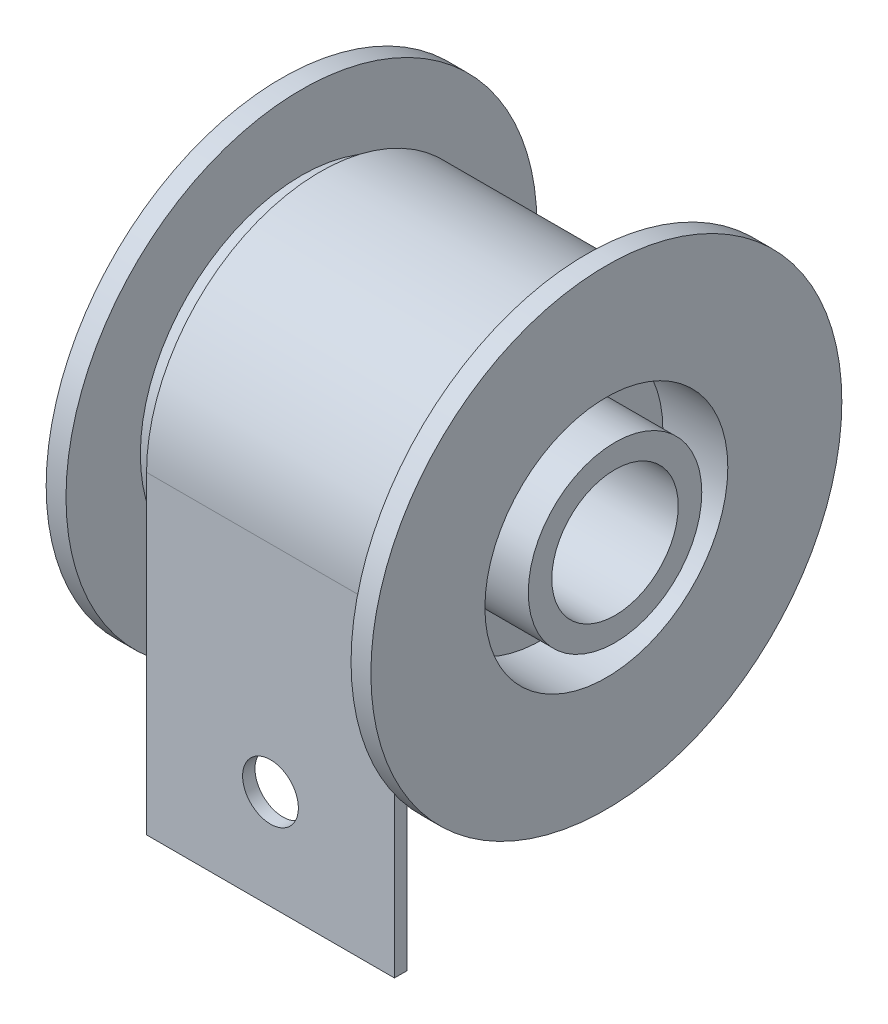
ISO-10303-21;
HEADER;
FILE_DESCRIPTION(('STEP AP214'),'2;1');
FILE_NAME('part.step','',(''),(''),'','','');
FILE_SCHEMA(('AUTOMOTIVE_DESIGN { 1 0 10303 214 1 1 1 1 }'));
ENDSEC;
DATA;
#1=APPLICATION_CONTEXT('core data for automotive mechanical design processes');
#2=APPLICATION_PROTOCOL_DEFINITION('international standard','automotive_design',2000,#1);
#3=PRODUCT_CONTEXT('',#1,'mechanical');
#4=PRODUCT('Part','Part','',(#3));
#5=PRODUCT_RELATED_PRODUCT_CATEGORY('part','',(#4));
#6=PRODUCT_DEFINITION_FORMATION('','',#4);
#7=PRODUCT_DEFINITION_CONTEXT('part definition',#1,'design');
#8=PRODUCT_DEFINITION('design','',#6,#7);
#9=PRODUCT_DEFINITION_SHAPE('','',#8);
#10=(LENGTH_UNIT() NAMED_UNIT(*) SI_UNIT(.MILLI.,.METRE.));
#11=(NAMED_UNIT(*) PLANE_ANGLE_UNIT() SI_UNIT($,.RADIAN.));
#12=(NAMED_UNIT(*) SI_UNIT($,.STERADIAN.) SOLID_ANGLE_UNIT());
#13=UNCERTAINTY_MEASURE_WITH_UNIT(LENGTH_MEASURE(1.E-05),#10,'distance_accuracy_value','');
#14=(GEOMETRIC_REPRESENTATION_CONTEXT(3) GLOBAL_UNCERTAINTY_ASSIGNED_CONTEXT((#13)) GLOBAL_UNIT_ASSIGNED_CONTEXT((#10,
#11,#12)) REPRESENTATION_CONTEXT('',''));
#15=CARTESIAN_POINT('',(0.,0.,0.));
#16=DIRECTION('',(0.,0.,1.));
#17=DIRECTION('',(1.,0.,0.));
#18=AXIS2_PLACEMENT_3D('',#15,#16,#17);
#19=CARTESIAN_POINT('',(-13.8,-7.19126770361165,-7.));
#20=DIRECTION('',(-1.,0.,0.));
#21=DIRECTION('',(0.,0.,1.));
#22=AXIS2_PLACEMENT_3D('',#19,#20,#21);
#23=PLANE('',#22);
#24=CARTESIAN_POINT('',(-13.8,0.,0.));
#25=DIRECTION('',(-1.,0.,0.));
#26=DIRECTION('',(0.,0.,-1.));
#27=AXIS2_PLACEMENT_3D('',#24,#25,#26);
#28=CIRCLE('',#27,7.);
#29=CARTESIAN_POINT('',(-13.8,0.,-7.));
#30=VERTEX_POINT('',#29);
#31=EDGE_CURVE('E321',#30,#30,#28,.F.);
#32=ORIENTED_EDGE('',*,*,#31,.F.);
#33=EDGE_LOOP('',(#32));
#34=FACE_BOUND('',#33,.T.);
#35=CARTESIAN_POINT('',(-13.8,0.,0.));
#36=DIRECTION('',(1.,0.,0.));
#37=DIRECTION('',(0.,0.,1.));
#38=AXIS2_PLACEMENT_3D('',#35,#36,#37);
#39=CIRCLE('',#38,5.1);
#40=CARTESIAN_POINT('',(-13.8,0.,5.1));
#41=VERTEX_POINT('',#40);
#42=EDGE_CURVE('E317',#41,#41,#39,.T.);
#43=ORIENTED_EDGE('',*,*,#42,.T.);
#44=EDGE_LOOP('',(#43));
#45=FACE_BOUND('',#44,.T.);
#46=ADVANCED_FACE('F17',(#34,#45),#23,.T.);
#47=CARTESIAN_POINT('',(13.8,-7.19126770361165,7.));
#48=DIRECTION('',(1.,0.,0.));
#49=DIRECTION('',(0.,0.,-1.));
#50=AXIS2_PLACEMENT_3D('',#47,#48,#49);
#51=PLANE('',#50);
#52=CARTESIAN_POINT('',(13.8,0.,0.));
#53=DIRECTION('',(1.,0.,0.));
#54=DIRECTION('',(0.,0.,1.));
#55=AXIS2_PLACEMENT_3D('',#52,#53,#54);
#56=CIRCLE('',#55,7.);
#57=CARTESIAN_POINT('',(13.8,0.,7.));
#58=VERTEX_POINT('',#57);
#59=EDGE_CURVE('E316',#58,#58,#56,.T.);
#60=ORIENTED_EDGE('',*,*,#59,.T.);
#61=EDGE_LOOP('',(#60));
#62=FACE_BOUND('',#61,.T.);
#63=CARTESIAN_POINT('',(13.8,0.,0.));
#64=DIRECTION('',(-1.,0.,0.));
#65=DIRECTION('',(0.,0.,-1.));
#66=AXIS2_PLACEMENT_3D('',#63,#64,#65);
#67=CIRCLE('',#66,5.1);
#68=CARTESIAN_POINT('',(13.8,0.,-5.1));
#69=VERTEX_POINT('',#68);
#70=EDGE_CURVE('E284',#69,#69,#67,.F.);
#71=ORIENTED_EDGE('',*,*,#70,.F.);
#72=EDGE_LOOP('',(#71));
#73=FACE_BOUND('',#72,.T.);
#74=ADVANCED_FACE('F195',(#62,#73),#51,.T.);
#75=CARTESIAN_POINT('',(13.1,-19.3529505311129,19.));
#76=DIRECTION('',(1.,0.,0.));
#77=DIRECTION('',(0.,0.,-1.));
#78=AXIS2_PLACEMENT_3D('',#75,#76,#77);
#79=PLANE('',#78);
#80=CARTESIAN_POINT('',(13.1,0.,0.));
#81=DIRECTION('',(1.,0.,0.));
#82=DIRECTION('',(0.,0.,1.));
#83=AXIS2_PLACEMENT_3D('',#80,#81,#82);
#84=CIRCLE('',#83,19.);
#85=CARTESIAN_POINT('',(13.1,0.,19.));
#86=VERTEX_POINT('',#85);
#87=EDGE_CURVE('E278',#86,#86,#84,.T.);
#88=ORIENTED_EDGE('',*,*,#87,.T.);
#89=EDGE_LOOP('',(#88));
#90=FACE_BOUND('',#89,.T.);
#91=CARTESIAN_POINT('',(13.1,0.,0.));
#92=DIRECTION('',(-1.,0.,0.));
#93=DIRECTION('',(0.,0.,-1.));
#94=AXIS2_PLACEMENT_3D('',#91,#92,#93);
#95=CIRCLE('',#94,9.8);
#96=CARTESIAN_POINT('',(13.1,0.,-9.8));
#97=VERTEX_POINT('',#96);
#98=EDGE_CURVE('E275',#97,#97,#95,.F.);
#99=ORIENTED_EDGE('',*,*,#98,.F.);
#100=EDGE_LOOP('',(#99));
#101=FACE_BOUND('',#100,.T.);
#102=ADVANCED_FACE('F201',(#90,#101),#79,.T.);
#103=CARTESIAN_POINT('',(11.5,-19.3529505311129,-19.));
#104=DIRECTION('',(-1.,0.,0.));
#105=DIRECTION('',(0.,0.,1.));
#106=AXIS2_PLACEMENT_3D('',#103,#104,#105);
#107=PLANE('',#106);
#108=CARTESIAN_POINT('',(11.5,0.,0.));
#109=DIRECTION('',(-1.,0.,0.));
#110=DIRECTION('',(0.,0.,-1.));
#111=AXIS2_PLACEMENT_3D('',#108,#109,#110);
#112=CIRCLE('',#111,19.);
#113=CARTESIAN_POINT('',(11.5,0.,-19.));
#114=VERTEX_POINT('',#113);
#115=EDGE_CURVE('E277',#114,#114,#112,.F.);
#116=ORIENTED_EDGE('',*,*,#115,.F.);
#117=EDGE_LOOP('',(#116));
#118=FACE_BOUND('',#117,.T.);
#119=CARTESIAN_POINT('',(11.5,0.,0.));
#120=DIRECTION('',(1.,0.,0.));
#121=DIRECTION('',(0.,0.,1.));
#122=AXIS2_PLACEMENT_3D('',#119,#120,#121);
#123=CIRCLE('',#122,13.);
#124=CARTESIAN_POINT('',(11.5,0.,13.));
#125=VERTEX_POINT('',#124);
#126=EDGE_CURVE('E281',#125,#125,#123,.T.);
#127=ORIENTED_EDGE('',*,*,#126,.T.);
#128=EDGE_LOOP('',(#127));
#129=FACE_BOUND('',#128,.T.);
#130=ADVANCED_FACE('F209',(#118,#129),#107,.T.);
#131=CARTESIAN_POINT('',(-11.5,-19.3529505311129,19.));
#132=DIRECTION('',(1.,0.,0.));
#133=DIRECTION('',(0.,0.,-1.));
#134=AXIS2_PLACEMENT_3D('',#131,#132,#133);
#135=PLANE('',#134);
#136=CARTESIAN_POINT('',(-11.5,0.,0.));
#137=DIRECTION('',(1.,0.,0.));
#138=DIRECTION('',(0.,0.,1.));
#139=AXIS2_PLACEMENT_3D('',#136,#137,#138);
#140=CIRCLE('',#139,19.);
#141=CARTESIAN_POINT('',(-11.5,0.,19.));
#142=VERTEX_POINT('',#141);
#143=EDGE_CURVE('E290',#142,#142,#140,.T.);
#144=ORIENTED_EDGE('',*,*,#143,.T.);
#145=EDGE_LOOP('',(#144));
#146=FACE_BOUND('',#145,.T.);
#147=CARTESIAN_POINT('',(-11.5,0.,0.));
#148=DIRECTION('',(-1.,0.,0.));
#149=DIRECTION('',(0.,0.,-1.));
#150=AXIS2_PLACEMENT_3D('',#147,#148,#149);
#151=CIRCLE('',#150,13.);
#152=CARTESIAN_POINT('',(-11.5,0.,-13.));
#153=VERTEX_POINT('',#152);
#154=EDGE_CURVE('E293',#153,#153,#151,.F.);
#155=ORIENTED_EDGE('',*,*,#154,.F.);
#156=EDGE_LOOP('',(#155));
#157=FACE_BOUND('',#156,.T.);
#158=ADVANCED_FACE('F213',(#146,#157),#135,.T.);
#159=CARTESIAN_POINT('',(-13.1,-19.3529505311129,-19.));
#160=DIRECTION('',(-1.,0.,0.));
#161=DIRECTION('',(0.,0.,1.));
#162=AXIS2_PLACEMENT_3D('',#159,#160,#161);
#163=PLANE('',#162);
#164=CARTESIAN_POINT('',(-13.1,0.,0.));
#165=DIRECTION('',(-1.,0.,0.));
#166=DIRECTION('',(0.,0.,-1.));
#167=AXIS2_PLACEMENT_3D('',#164,#165,#166);
#168=CIRCLE('',#167,19.);
#169=CARTESIAN_POINT('',(-13.1,0.,-19.));
#170=VERTEX_POINT('',#169);
#171=EDGE_CURVE('E296',#170,#170,#168,.F.);
#172=ORIENTED_EDGE('',*,*,#171,.F.);
#173=EDGE_LOOP('',(#172));
#174=FACE_BOUND('',#173,.T.);
#175=CARTESIAN_POINT('',(-13.1,0.,0.));
#176=DIRECTION('',(1.,0.,0.));
#177=DIRECTION('',(0.,0.,1.));
#178=AXIS2_PLACEMENT_3D('',#175,#176,#177);
#179=CIRCLE('',#178,9.8);
#180=CARTESIAN_POINT('',(-13.1,0.,9.8));
#181=VERTEX_POINT('',#180);
#182=EDGE_CURVE('E299',#181,#181,#179,.T.);
#183=ORIENTED_EDGE('',*,*,#182,.T.);
#184=EDGE_LOOP('',(#183));
#185=FACE_BOUND('',#184,.T.);
#186=ADVANCED_FACE('F217',(#174,#185),#163,.T.);
#187=CARTESIAN_POINT('',(7.86,-10.0677747850563,-9.8));
#188=DIRECTION('',(1.,0.,0.));
#189=DIRECTION('',(0.,1.,0.));
#190=AXIS2_PLACEMENT_3D('',#187,#188,#189);
#191=PLANE('',#190);
#192=CARTESIAN_POINT('',(7.86,0.,0.));
#193=DIRECTION('',(1.,0.,0.));
#194=DIRECTION('',(0.,0.,1.));
#195=AXIS2_PLACEMENT_3D('',#192,#193,#194);
#196=CIRCLE('',#195,9.8);
#197=CARTESIAN_POINT('',(7.86,0.,9.8));
#198=VERTEX_POINT('',#197);
#199=EDGE_CURVE('E272',#198,#198,#196,.T.);
#200=ORIENTED_EDGE('',*,*,#199,.T.);
#201=EDGE_LOOP('',(#200));
#202=FACE_BOUND('',#201,.T.);
#203=CARTESIAN_POINT('',(7.86,0.,0.));
#204=DIRECTION('',(-1.,0.,0.));
#205=DIRECTION('',(0.,0.,-1.));
#206=AXIS2_PLACEMENT_3D('',#203,#204,#205);
#207=CIRCLE('',#206,7.);
#208=CARTESIAN_POINT('',(7.86,0.,-7.));
#209=VERTEX_POINT('',#208);
#210=EDGE_CURVE('E303',#209,#209,#207,.F.);
#211=ORIENTED_EDGE('',*,*,#210,.F.);
#212=EDGE_LOOP('',(#211));
#213=FACE_BOUND('',#212,.T.);
#214=ADVANCED_FACE('F221',(#202,#213),#191,.T.);
#215=CARTESIAN_POINT('',(-7.86,-10.0677747850563,9.8));
#216=DIRECTION('',(-1.,0.,0.));
#217=DIRECTION('',(0.,1.,0.));
#218=AXIS2_PLACEMENT_3D('',#215,#216,#217);
#219=PLANE('',#218);
#220=CARTESIAN_POINT('',(-7.86,0.,0.));
#221=DIRECTION('',(-1.,0.,0.));
#222=DIRECTION('',(0.,0.,-1.));
#223=AXIS2_PLACEMENT_3D('',#220,#221,#222);
#224=CIRCLE('',#223,9.8);
#225=CARTESIAN_POINT('',(-7.86,0.,-9.8));
#226=VERTEX_POINT('',#225);
#227=EDGE_CURVE('E93',#226,#226,#224,.F.);
#228=ORIENTED_EDGE('',*,*,#227,.F.);
#229=EDGE_LOOP('',(#228));
#230=FACE_BOUND('',#229,.T.);
#231=CARTESIAN_POINT('',(-7.86,0.,0.));
#232=DIRECTION('',(1.,0.,0.));
#233=DIRECTION('',(0.,0.,1.));
#234=AXIS2_PLACEMENT_3D('',#231,#232,#233);
#235=CIRCLE('',#234,7.);
#236=CARTESIAN_POINT('',(-7.86,0.,7.));
#237=VERTEX_POINT('',#236);
#238=EDGE_CURVE('E90',#237,#237,#235,.T.);
#239=ORIENTED_EDGE('',*,*,#238,.T.);
#240=EDGE_LOOP('',(#239));
#241=FACE_BOUND('',#240,.T.);
#242=ADVANCED_FACE('F225',(#230,#241),#219,.T.);
#243=CARTESIAN_POINT('',(10.,0.,0.));
#244=DIRECTION('',(-1.,0.,0.));
#245=DIRECTION('',(0.,0.382683432365087,-0.923879532511288));
#246=AXIS2_PLACEMENT_3D('',#243,#244,#245);
#247=CYLINDRICAL_SURFACE('',#246,14.);
#248=DIRECTION('',(-1.,0.,0.));
#249=VECTOR('',#248,1.);
#250=CARTESIAN_POINT('',(10.,-9.89949493661168,9.8994949366117));
#251=LINE('',#250,#249);
#252=CARTESIAN_POINT('',(10.,-9.89949493661168,9.8994949366117));
#253=VERTEX_POINT('',#252);
#254=CARTESIAN_POINT('',(-10.,-9.89949493661168,9.8994949366117));
#255=VERTEX_POINT('',#254);
#256=EDGE_CURVE('E78',#253,#255,#251,.T.);
#257=ORIENTED_EDGE('',*,*,#256,.T.);
#258=CARTESIAN_POINT('',(-10.,0.,0.));
#259=DIRECTION('',(1.,0.,0.));
#260=DIRECTION('',(0.,-0.707106781186544,0.707106781186551));
#261=AXIS2_PLACEMENT_3D('',#258,#259,#260);
#262=CIRCLE('',#261,14.);
#263=CARTESIAN_POINT('',(-10.,0.,14.));
#264=VERTEX_POINT('',#263);
#265=EDGE_CURVE('E67',#255,#264,#262,.T.);
#266=ORIENTED_EDGE('',*,*,#265,.T.);
#267=DIRECTION('',(1.,0.,0.));
#268=VECTOR('',#267,1.);
#269=CARTESIAN_POINT('',(-10.,0.,14.));
#270=LINE('',#269,#268);
#271=CARTESIAN_POINT('',(10.,0.,14.));
#272=VERTEX_POINT('',#271);
#273=EDGE_CURVE('E77',#272,#264,#270,.F.);
#274=ORIENTED_EDGE('',*,*,#273,.F.);
#275=CARTESIAN_POINT('',(10.,0.,0.));
#276=DIRECTION('',(-1.,0.,0.));
#277=DIRECTION('',(0.,0.,1.));
#278=AXIS2_PLACEMENT_3D('',#275,#276,#277);
#279=CIRCLE('',#278,14.);
#280=EDGE_CURVE('E89',#253,#272,#279,.F.);
#281=ORIENTED_EDGE('',*,*,#280,.F.);
#282=EDGE_LOOP('',(#257,#266,#274,#281));
#283=FACE_BOUND('',#282,.T.);
#284=ADVANCED_FACE('F88',(#283),#247,.T.);
#285=CARTESIAN_POINT('',(10.,-25.333333333333,14.));
#286=DIRECTION('',(0.,0.,1.));
#287=DIRECTION('',(0.,1.,0.));
#288=AXIS2_PLACEMENT_3D('',#285,#286,#287);
#289=PLANE('',#288);
#290=DIRECTION('',(0.,-1.,0.));
#291=VECTOR('',#290,1.);
#292=CARTESIAN_POINT('',(-10.,0.,14.));
#293=LINE('',#292,#291);
#294=CARTESIAN_POINT('',(-10.,-25.333333333333,14.));
#295=VERTEX_POINT('',#294);
#296=EDGE_CURVE('E72',#264,#295,#293,.T.);
#297=ORIENTED_EDGE('',*,*,#296,.T.);
#298=DIRECTION('',(1.,0.,0.));
#299=VECTOR('',#298,1.);
#300=CARTESIAN_POINT('',(-10.,-25.333333333333,14.));
#301=LINE('',#300,#299);
#302=CARTESIAN_POINT('',(10.,-25.333333333333,14.));
#303=VERTEX_POINT('',#302);
#304=EDGE_CURVE('E108',#303,#295,#301,.F.);
#305=ORIENTED_EDGE('',*,*,#304,.F.);
#306=DIRECTION('',(0.,1.,0.));
#307=VECTOR('',#306,1.);
#308=CARTESIAN_POINT('',(10.,-25.333333333333,14.));
#309=LINE('',#308,#307);
#310=EDGE_CURVE('E113',#272,#303,#309,.F.);
#311=ORIENTED_EDGE('',*,*,#310,.F.);
#312=ORIENTED_EDGE('',*,*,#273,.T.);
#313=EDGE_LOOP('',(#297,#305,#311,#312));
#314=FACE_BOUND('',#313,.T.);
#315=CARTESIAN_POINT('',(0.,-17.333333333333,14.));
#316=DIRECTION('',(0.,0.,-1.));
#317=DIRECTION('',(1.,0.,0.));
#318=AXIS2_PLACEMENT_3D('',#315,#316,#317);
#319=CIRCLE('',#318,2.25);
#320=CARTESIAN_POINT('',(2.25,-17.333333333333,14.));
#321=VERTEX_POINT('',#320);
#322=EDGE_CURVE('E117',#321,#321,#319,.F.);
#323=ORIENTED_EDGE('',*,*,#322,.F.);
#324=EDGE_LOOP('',(#323));
#325=FACE_BOUND('',#324,.T.);
#326=ADVANCED_FACE('F178',(#314,#325),#289,.T.);
#327=CARTESIAN_POINT('',(-10.,-25.333333333333,13.));
#328=DIRECTION('',(0.,-1.,0.));
#329=DIRECTION('',(1.,0.,0.));
#330=AXIS2_PLACEMENT_3D('',#327,#328,#329);
#331=PLANE('',#330);
#332=DIRECTION('',(0.,0.,-1.));
#333=VECTOR('',#332,1.);
#334=CARTESIAN_POINT('',(-10.,-25.333333333333,14.));
#335=LINE('',#334,#333);
#336=CARTESIAN_POINT('',(-10.,-25.333333333333,13.));
#337=VERTEX_POINT('',#336);
#338=EDGE_CURVE('E122',#295,#337,#335,.T.);
#339=ORIENTED_EDGE('',*,*,#338,.T.);
#340=DIRECTION('',(1.,0.,0.));
#341=VECTOR('',#340,1.);
#342=CARTESIAN_POINT('',(-10.,-25.333333333333,13.));
#343=LINE('',#342,#341);
#344=CARTESIAN_POINT('',(10.,-25.333333333333,13.));
#345=VERTEX_POINT('',#344);
#346=EDGE_CURVE('E125',#345,#337,#343,.F.);
#347=ORIENTED_EDGE('',*,*,#346,.F.);
#348=DIRECTION('',(0.,0.,1.));
#349=VECTOR('',#348,1.);
#350=CARTESIAN_POINT('',(10.,-25.333333333333,13.));
#351=LINE('',#350,#349);
#352=EDGE_CURVE('E130',#303,#345,#351,.F.);
#353=ORIENTED_EDGE('',*,*,#352,.F.);
#354=ORIENTED_EDGE('',*,*,#304,.T.);
#355=EDGE_LOOP('',(#339,#347,#353,#354));
#356=FACE_BOUND('',#355,.T.);
#357=ADVANCED_FACE('F173',(#356),#331,.T.);
#358=CARTESIAN_POINT('',(-10.,-25.333333333333,13.));
#359=DIRECTION('',(0.,0.,-1.));
#360=DIRECTION('',(0.,1.,0.));
#361=AXIS2_PLACEMENT_3D('',#358,#359,#360);
#362=PLANE('',#361);
#363=DIRECTION('',(0.,1.,0.));
#364=VECTOR('',#363,1.);
#365=CARTESIAN_POINT('',(-10.,-25.333333333333,13.));
#366=LINE('',#365,#364);
#367=CARTESIAN_POINT('',(-10.,0.,13.));
#368=VERTEX_POINT('',#367);
#369=EDGE_CURVE('E134',#337,#368,#366,.T.);
#370=ORIENTED_EDGE('',*,*,#369,.T.);
#371=DIRECTION('',(1.,0.,0.));
#372=VECTOR('',#371,1.);
#373=CARTESIAN_POINT('',(-10.,0.,13.));
#374=LINE('',#373,#372);
#375=CARTESIAN_POINT('',(10.,0.,13.));
#376=VERTEX_POINT('',#375);
#377=EDGE_CURVE('E139',#376,#368,#374,.F.);
#378=ORIENTED_EDGE('',*,*,#377,.F.);
#379=DIRECTION('',(0.,-1.,0.));
#380=VECTOR('',#379,1.);
#381=CARTESIAN_POINT('',(10.,0.,13.));
#382=LINE('',#381,#380);
#383=EDGE_CURVE('E143',#345,#376,#382,.F.);
#384=ORIENTED_EDGE('',*,*,#383,.F.);
#385=ORIENTED_EDGE('',*,*,#346,.T.);
#386=EDGE_LOOP('',(#370,#378,#384,#385));
#387=FACE_BOUND('',#386,.T.);
#388=CARTESIAN_POINT('',(0.,-17.333333333333,13.));
#389=DIRECTION('',(0.,0.,1.));
#390=DIRECTION('',(-1.,0.,0.));
#391=AXIS2_PLACEMENT_3D('',#388,#389,#390);
#392=CIRCLE('',#391,2.25);
#393=CARTESIAN_POINT('',(-2.25,-17.333333333333,13.));
#394=VERTEX_POINT('',#393);
#395=EDGE_CURVE('E85',#394,#394,#392,.T.);
#396=ORIENTED_EDGE('',*,*,#395,.T.);
#397=EDGE_LOOP('',(#396));
#398=FACE_BOUND('',#397,.T.);
#399=ADVANCED_FACE('F169',(#387,#398),#362,.T.);
#400=CARTESIAN_POINT('',(-10.,-9.89949493661169,9.89949493661169));
#401=DIRECTION('',(0.,0.707106781186548,0.707106781186548));
#402=DIRECTION('',(1.,0.,0.));
#403=AXIS2_PLACEMENT_3D('',#400,#401,#402);
#404=PLANE('',#403);
#405=DIRECTION('',(0.,-0.707106781186548,0.707106781186548));
#406=VECTOR('',#405,1.);
#407=CARTESIAN_POINT('',(-10.,-9.19238815542512,9.19238815542512));
#408=LINE('',#407,#406);
#409=CARTESIAN_POINT('',(-10.,-9.19238815542512,9.19238815542512));
#410=VERTEX_POINT('',#409);
#411=EDGE_CURVE('E70',#410,#255,#408,.T.);
#412=ORIENTED_EDGE('',*,*,#411,.T.);
#413=ORIENTED_EDGE('',*,*,#256,.F.);
#414=DIRECTION('',(0.,0.707106781186548,-0.707106781186548));
#415=VECTOR('',#414,1.);
#416=CARTESIAN_POINT('',(10.,-9.89949493661169,9.89949493661169));
#417=LINE('',#416,#415);
#418=CARTESIAN_POINT('',(10.,-9.1923881554251,9.1923881554251));
#419=VERTEX_POINT('',#418);
#420=EDGE_CURVE('E84',#419,#253,#417,.F.);
#421=ORIENTED_EDGE('',*,*,#420,.F.);
#422=DIRECTION('',(-1.,0.,0.));
#423=VECTOR('',#422,1.);
#424=CARTESIAN_POINT('',(10.,-9.1923881554251,9.1923881554251));
#425=LINE('',#424,#423);
#426=EDGE_CURVE('E35',#419,#410,#425,.T.);
#427=ORIENTED_EDGE('',*,*,#426,.T.);
#428=EDGE_LOOP('',(#412,#413,#421,#427));
#429=FACE_BOUND('',#428,.T.);
#430=ADVANCED_FACE('F82',(#429),#404,.T.);
#431=CARTESIAN_POINT('',(10.,-25.333333333333,14.));
#432=DIRECTION('',(1.,0.,0.));
#433=DIRECTION('',(0.,0.,-1.));
#434=AXIS2_PLACEMENT_3D('',#431,#432,#433);
#435=PLANE('',#434);
#436=ORIENTED_EDGE('',*,*,#280,.T.);
#437=ORIENTED_EDGE('',*,*,#310,.T.);
#438=ORIENTED_EDGE('',*,*,#352,.T.);
#439=ORIENTED_EDGE('',*,*,#383,.T.);
#440=CARTESIAN_POINT('',(10.,0.,0.));
#441=DIRECTION('',(-1.,0.,0.));
#442=DIRECTION('',(0.,0.,-1.));
#443=AXIS2_PLACEMENT_3D('',#440,#441,#442);
#444=CIRCLE('',#443,13.);
#445=EDGE_CURVE('E26',#376,#419,#444,.T.);
#446=ORIENTED_EDGE('',*,*,#445,.T.);
#447=ORIENTED_EDGE('',*,*,#420,.T.);
#448=EDGE_LOOP('',(#436,#437,#438,#439,#446,#447));
#449=FACE_BOUND('',#448,.T.);
#450=ADVANCED_FACE('F163',(#449),#435,.T.);
#451=CARTESIAN_POINT('',(-10.,-25.333333333333,14.));
#452=DIRECTION('',(-1.,0.,0.));
#453=DIRECTION('',(0.,1.,0.));
#454=AXIS2_PLACEMENT_3D('',#451,#452,#453);
#455=PLANE('',#454);
#456=ORIENTED_EDGE('',*,*,#265,.F.);
#457=ORIENTED_EDGE('',*,*,#411,.F.);
#458=CARTESIAN_POINT('',(-10.,0.,0.));
#459=DIRECTION('',(1.,0.,0.));
#460=DIRECTION('',(0.,0.,-1.));
#461=AXIS2_PLACEMENT_3D('',#458,#459,#460);
#462=CIRCLE('',#461,13.);
#463=EDGE_CURVE('E11',#368,#410,#462,.F.);
#464=ORIENTED_EDGE('',*,*,#463,.F.);
#465=ORIENTED_EDGE('',*,*,#369,.F.);
#466=ORIENTED_EDGE('',*,*,#338,.F.);
#467=ORIENTED_EDGE('',*,*,#296,.F.);
#468=EDGE_LOOP('',(#456,#457,#464,#465,#466,#467));
#469=FACE_BOUND('',#468,.T.);
#470=ADVANCED_FACE('F69',(#469),#455,.T.);
#471=CARTESIAN_POINT('',(60.,0.,0.));
#472=DIRECTION('',(1.,0.,0.));
#473=DIRECTION('',(0.,0.,1.));
#474=AXIS2_PLACEMENT_3D('',#471,#472,#473);
#475=CYLINDRICAL_SURFACE('',#474,7.);
#476=ORIENTED_EDGE('',*,*,#31,.T.);
#477=EDGE_LOOP('',(#476));
#478=FACE_BOUND('',#477,.T.);
#479=ORIENTED_EDGE('',*,*,#238,.F.);
#480=EDGE_LOOP('',(#479));
#481=FACE_BOUND('',#480,.T.);
#482=ADVANCED_FACE('F242',(#478,#481),#475,.T.);
#483=CARTESIAN_POINT('',(60.,0.,0.));
#484=DIRECTION('',(1.,0.,0.));
#485=DIRECTION('',(0.,1.42053890106804E-07,0.99999999999999));
#486=AXIS2_PLACEMENT_3D('',#483,#484,#485);
#487=CYLINDRICAL_SURFACE('',#486,5.1);
#488=ORIENTED_EDGE('',*,*,#70,.T.);
#489=EDGE_LOOP('',(#488));
#490=FACE_BOUND('',#489,.T.);
#491=ORIENTED_EDGE('',*,*,#42,.F.);
#492=EDGE_LOOP('',(#491));
#493=FACE_BOUND('',#492,.T.);
#494=ADVANCED_FACE('F245',(#490,#493),#487,.F.);
#495=CARTESIAN_POINT('',(60.,0.,0.));
#496=DIRECTION('',(1.,0.,0.));
#497=DIRECTION('',(0.,0.,1.));
#498=AXIS2_PLACEMENT_3D('',#495,#496,#497);
#499=CYLINDRICAL_SURFACE('',#498,7.);
#500=ORIENTED_EDGE('',*,*,#210,.T.);
#501=EDGE_LOOP('',(#500));
#502=FACE_BOUND('',#501,.T.);
#503=ORIENTED_EDGE('',*,*,#59,.F.);
#504=EDGE_LOOP('',(#503));
#505=FACE_BOUND('',#504,.T.);
#506=ADVANCED_FACE('F249',(#502,#505),#499,.T.);
#507=CARTESIAN_POINT('',(60.,0.,0.));
#508=DIRECTION('',(1.,0.,0.));
#509=DIRECTION('',(0.,0.,1.));
#510=AXIS2_PLACEMENT_3D('',#507,#508,#509);
#511=CYLINDRICAL_SURFACE('',#510,19.);
#512=ORIENTED_EDGE('',*,*,#115,.T.);
#513=EDGE_LOOP('',(#512));
#514=FACE_BOUND('',#513,.T.);
#515=ORIENTED_EDGE('',*,*,#87,.F.);
#516=EDGE_LOOP('',(#515));
#517=FACE_BOUND('',#516,.T.);
#518=ADVANCED_FACE('F253',(#514,#517),#511,.T.);
#519=CARTESIAN_POINT('',(60.,0.,0.));
#520=DIRECTION('',(1.,0.,0.));
#521=DIRECTION('',(0.,0.,1.));
#522=AXIS2_PLACEMENT_3D('',#519,#520,#521);
#523=CYLINDRICAL_SURFACE('',#522,13.);
#524=ORIENTED_EDGE('',*,*,#154,.T.);
#525=EDGE_LOOP('',(#524));
#526=FACE_BOUND('',#525,.T.);
#527=ORIENTED_EDGE('',*,*,#426,.F.);
#528=ORIENTED_EDGE('',*,*,#445,.F.);
#529=ORIENTED_EDGE('',*,*,#377,.T.);
#530=ORIENTED_EDGE('',*,*,#463,.T.);
#531=EDGE_LOOP('',(#527,#528,#529,#530));
#532=FACE_BOUND('',#531,.T.);
#533=ORIENTED_EDGE('',*,*,#126,.F.);
#534=EDGE_LOOP('',(#533));
#535=FACE_BOUND('',#534,.T.);
#536=ADVANCED_FACE('F166',(#526,#532,#535),#523,.T.);
#537=CARTESIAN_POINT('',(60.,0.,0.));
#538=DIRECTION('',(1.,0.,0.));
#539=DIRECTION('',(0.,0.,1.));
#540=AXIS2_PLACEMENT_3D('',#537,#538,#539);
#541=CYLINDRICAL_SURFACE('',#540,19.);
#542=ORIENTED_EDGE('',*,*,#171,.T.);
#543=EDGE_LOOP('',(#542));
#544=FACE_BOUND('',#543,.T.);
#545=ORIENTED_EDGE('',*,*,#143,.F.);
#546=EDGE_LOOP('',(#545));
#547=FACE_BOUND('',#546,.T.);
#548=ADVANCED_FACE('F260',(#544,#547),#541,.T.);
#549=CARTESIAN_POINT('',(50.,0.,0.));
#550=DIRECTION('',(1.,0.,0.));
#551=DIRECTION('',(0.,0.,1.));
#552=AXIS2_PLACEMENT_3D('',#549,#550,#551);
#553=CYLINDRICAL_SURFACE('',#552,9.8);
#554=ORIENTED_EDGE('',*,*,#199,.F.);
#555=EDGE_LOOP('',(#554));
#556=FACE_BOUND('',#555,.T.);
#557=ORIENTED_EDGE('',*,*,#98,.T.);
#558=EDGE_LOOP('',(#557));
#559=FACE_BOUND('',#558,.T.);
#560=ADVANCED_FACE('F191',(#556,#559),#553,.F.);
#561=CARTESIAN_POINT('',(50.,0.,0.));
#562=DIRECTION('',(1.,0.,0.));
#563=DIRECTION('',(0.,0.,1.));
#564=AXIS2_PLACEMENT_3D('',#561,#562,#563);
#565=CYLINDRICAL_SURFACE('',#564,9.8);
#566=ORIENTED_EDGE('',*,*,#182,.F.);
#567=EDGE_LOOP('',(#566));
#568=FACE_BOUND('',#567,.T.);
#569=ORIENTED_EDGE('',*,*,#227,.T.);
#570=EDGE_LOOP('',(#569));
#571=FACE_BOUND('',#570,.T.);
#572=ADVANCED_FACE('F185',(#568,#571),#565,.F.);
#573=CARTESIAN_POINT('',(0.,-17.333333333333,13.));
#574=DIRECTION('',(0.,0.,1.));
#575=DIRECTION('',(-0.99999999999999,1.42053906538104E-07,0.));
#576=AXIS2_PLACEMENT_3D('',#573,#574,#575);
#577=CYLINDRICAL_SURFACE('',#576,2.25);
#578=ORIENTED_EDGE('',*,*,#395,.F.);
#579=EDGE_LOOP('',(#578));
#580=FACE_BOUND('',#579,.T.);
#581=ORIENTED_EDGE('',*,*,#322,.T.);
#582=EDGE_LOOP('',(#581));
#583=FACE_BOUND('',#582,.T.);
#584=ADVANCED_FACE('F19',(#580,#583),#577,.F.);
#585=CLOSED_SHELL('',(#46,#74,#102,#130,#158,#186,#214,#242,#284,#326,#357,#399,#430,#450,#470,
#482,#494,#506,#518,#536,#548,#560,#572,#584));
#586=MANIFOLD_SOLID_BREP('B1',#585);
#587=ADVANCED_BREP_SHAPE_REPRESENTATION('',(#18,#586),#14);
#588=SHAPE_DEFINITION_REPRESENTATION(#9,#587);
ENDSEC;
END-ISO-10303-21;
